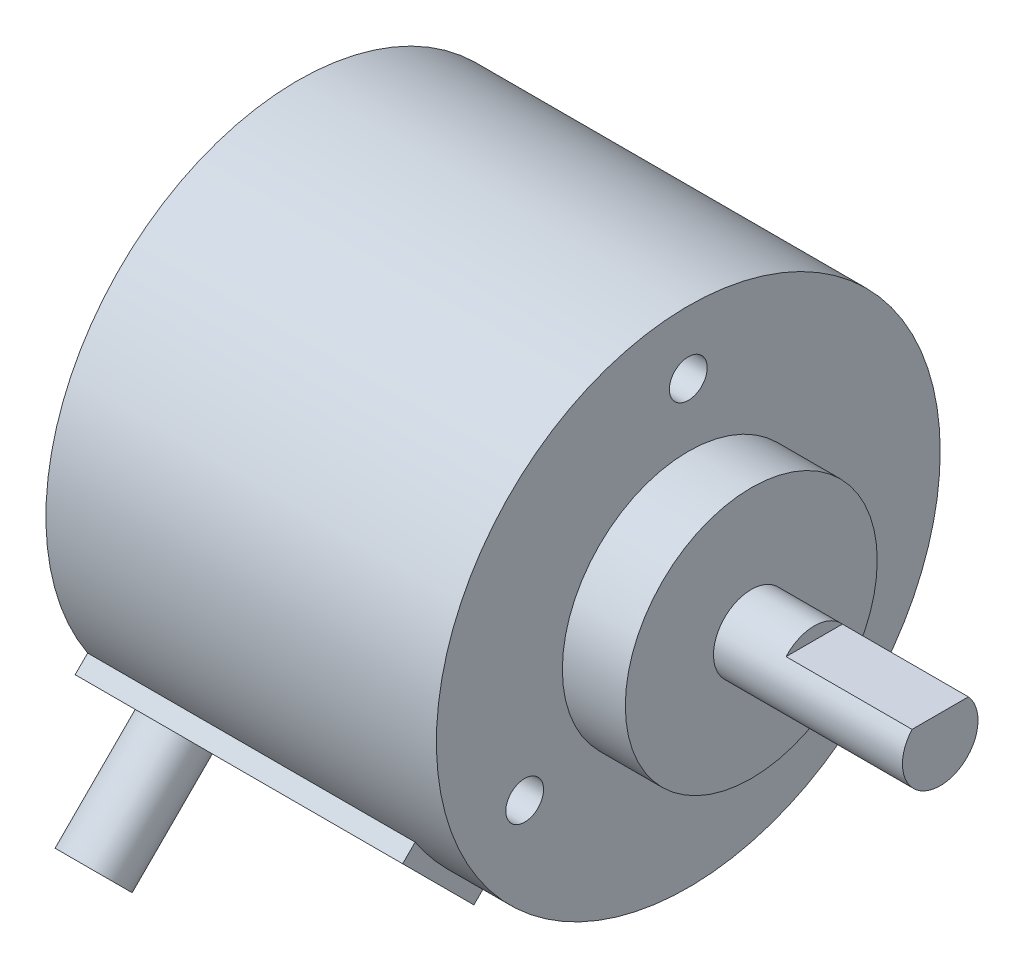
ISO-10303-21;
HEADER;
FILE_DESCRIPTION(('STEP AP214'),'2;1');
FILE_NAME('part.step','',(''),(''),'','','');
FILE_SCHEMA(('AUTOMOTIVE_DESIGN { 1 0 10303 214 1 1 1 1 }'));
ENDSEC;
DATA;
#1=APPLICATION_CONTEXT('core data for automotive mechanical design processes');
#2=APPLICATION_PROTOCOL_DEFINITION('international standard','automotive_design',2000,#1);
#3=PRODUCT_CONTEXT('',#1,'mechanical');
#4=PRODUCT('Part','Part','',(#3));
#5=PRODUCT_RELATED_PRODUCT_CATEGORY('part','',(#4));
#6=PRODUCT_DEFINITION_FORMATION('','',#4);
#7=PRODUCT_DEFINITION_CONTEXT('part definition',#1,'design');
#8=PRODUCT_DEFINITION('design','',#6,#7);
#9=PRODUCT_DEFINITION_SHAPE('','',#8);
#10=(LENGTH_UNIT() NAMED_UNIT(*) SI_UNIT(.MILLI.,.METRE.));
#11=(NAMED_UNIT(*) PLANE_ANGLE_UNIT() SI_UNIT($,.RADIAN.));
#12=(NAMED_UNIT(*) SI_UNIT($,.STERADIAN.) SOLID_ANGLE_UNIT());
#13=UNCERTAINTY_MEASURE_WITH_UNIT(LENGTH_MEASURE(1.E-05),#10,'distance_accuracy_value','');
#14=(GEOMETRIC_REPRESENTATION_CONTEXT(3) GLOBAL_UNCERTAINTY_ASSIGNED_CONTEXT((#13)) GLOBAL_UNIT_ASSIGNED_CONTEXT((#10,
#11,#12)) REPRESENTATION_CONTEXT('',''));
#15=CARTESIAN_POINT('',(0.,0.,0.));
#16=DIRECTION('',(0.,0.,1.));
#17=DIRECTION('',(1.,0.,0.));
#18=AXIS2_PLACEMENT_3D('',#15,#16,#17);
#19=CARTESIAN_POINT('',(5.,0.,0.));
#20=DIRECTION('',(-1.,0.,0.));
#21=DIRECTION('',(0.,0.,1.));
#22=AXIS2_PLACEMENT_3D('',#19,#20,#21);
#23=CYLINDRICAL_SURFACE('',#22,20.);
#24=CARTESIAN_POINT('',(5.,0.,0.));
#25=DIRECTION('',(1.,0.,0.));
#26=DIRECTION('',(0.,0.,-1.));
#27=AXIS2_PLACEMENT_3D('',#24,#25,#26);
#28=CIRCLE('',#27,20.);
#29=CARTESIAN_POINT('',(5.,0.,-20.));
#30=VERTEX_POINT('',#29);
#31=EDGE_CURVE('E11',#30,#30,#28,.T.);
#32=ORIENTED_EDGE('',*,*,#31,.F.);
#33=EDGE_LOOP('',(#32));
#34=FACE_BOUND('',#33,.T.);
#35=DIRECTION('',(-1.,0.,0.));
#36=VECTOR('',#35,1.);
#37=CARTESIAN_POINT('',(5.,-11.0279793358049,16.6848335852971));
#38=LINE('',#37,#36);
#39=CARTESIAN_POINT('',(0.,-11.0279793358049,16.6848335852971));
#40=VERTEX_POINT('',#39);
#41=CARTESIAN_POINT('',(-26.,-11.0279793358049,16.6848335852972));
#42=VERTEX_POINT('',#41);
#43=EDGE_CURVE('E51',#40,#42,#38,.T.);
#44=ORIENTED_EDGE('',*,*,#43,.F.);
#45=CARTESIAN_POINT('',(0.,0.,0.));
#46=DIRECTION('',(1.,0.,0.));
#47=DIRECTION('',(0.,0.,-1.));
#48=AXIS2_PLACEMENT_3D('',#45,#46,#47);
#49=CIRCLE('',#48,20.);
#50=CARTESIAN_POINT('',(0.,-16.6848335852973,11.0279793358047));
#51=VERTEX_POINT('',#50);
#52=EDGE_CURVE('E98',#51,#40,#49,.F.);
#53=ORIENTED_EDGE('',*,*,#52,.F.);
#54=DIRECTION('',(-1.,0.,0.));
#55=VECTOR('',#54,1.);
#56=CARTESIAN_POINT('',(5.,-16.6848335852973,11.0279793358047));
#57=LINE('',#56,#55);
#58=CARTESIAN_POINT('',(-26.,-16.6848335852973,11.0279793358047));
#59=VERTEX_POINT('',#58);
#60=EDGE_CURVE('E106',#59,#51,#57,.F.);
#61=ORIENTED_EDGE('',*,*,#60,.F.);
#62=CARTESIAN_POINT('',(-26.,0.,0.));
#63=DIRECTION('',(-1.,0.,0.));
#64=DIRECTION('',(0.,0.,1.));
#65=AXIS2_PLACEMENT_3D('',#62,#63,#64);
#66=CIRCLE('',#65,20.);
#67=EDGE_CURVE('E110',#42,#59,#66,.T.);
#68=ORIENTED_EDGE('',*,*,#67,.F.);
#69=EDGE_LOOP('',(#44,#53,#61,#68));
#70=FACE_BOUND('',#69,.T.);
#71=ADVANCED_FACE('F35',(#34,#70),#23,.T.);
#72=CARTESIAN_POINT('',(10.,0.,0.));
#73=DIRECTION('',(1.,0.,0.));
#74=DIRECTION('',(0.,0.,-1.));
#75=AXIS2_PLACEMENT_3D('',#72,#73,#74);
#76=PLANE('',#75);
#77=CARTESIAN_POINT('',(10.,0.,0.));
#78=DIRECTION('',(1.,0.,0.));
#79=DIRECTION('',(0.,0.,-1.));
#80=AXIS2_PLACEMENT_3D('',#77,#78,#79);
#81=CIRCLE('',#80,10.);
#82=CARTESIAN_POINT('',(10.,0.,-10.));
#83=VERTEX_POINT('',#82);
#84=EDGE_CURVE('E43',#83,#83,#81,.T.);
#85=ORIENTED_EDGE('',*,*,#84,.T.);
#86=EDGE_LOOP('',(#85));
#87=FACE_BOUND('',#86,.T.);
#88=CARTESIAN_POINT('',(10.,0.,0.));
#89=DIRECTION('',(1.,0.,0.));
#90=DIRECTION('',(0.,0.,-1.));
#91=AXIS2_PLACEMENT_3D('',#88,#89,#90);
#92=CIRCLE('',#91,3.);
#93=CARTESIAN_POINT('',(10.,0.,-3.));
#94=VERTEX_POINT('',#93);
#95=EDGE_CURVE('E136',#94,#94,#92,.T.);
#96=ORIENTED_EDGE('',*,*,#95,.F.);
#97=EDGE_LOOP('',(#96));
#98=FACE_BOUND('',#97,.T.);
#99=ADVANCED_FACE('F194',(#87,#98),#76,.T.);
#100=CARTESIAN_POINT('',(5.,0.,0.));
#101=DIRECTION('',(1.,0.,0.));
#102=DIRECTION('',(0.,0.,-1.));
#103=AXIS2_PLACEMENT_3D('',#100,#101,#102);
#104=PLANE('',#103);
#105=CARTESIAN_POINT('',(5.,-7.50000000000001,12.9903810567666));
#106=DIRECTION('',(1.,0.,0.));
#107=DIRECTION('',(0.,0.,-1.));
#108=AXIS2_PLACEMENT_3D('',#105,#106,#107);
#109=CIRCLE('',#108,1.5);
#110=CARTESIAN_POINT('',(5.,-7.50000000000001,11.4903810567666));
#111=VERTEX_POINT('',#110);
#112=EDGE_CURVE('E156',#111,#111,#109,.T.);
#113=ORIENTED_EDGE('',*,*,#112,.F.);
#114=EDGE_LOOP('',(#113));
#115=FACE_BOUND('',#114,.T.);
#116=CARTESIAN_POINT('',(5.,-7.5,-12.9903810567666));
#117=DIRECTION('',(1.,0.,0.));
#118=DIRECTION('',(0.,0.,-1.));
#119=AXIS2_PLACEMENT_3D('',#116,#117,#118);
#120=CIRCLE('',#119,1.5);
#121=CARTESIAN_POINT('',(5.,-7.5,-14.4903810567666));
#122=VERTEX_POINT('',#121);
#123=EDGE_CURVE('E173',#122,#122,#120,.T.);
#124=ORIENTED_EDGE('',*,*,#123,.F.);
#125=EDGE_LOOP('',(#124));
#126=FACE_BOUND('',#125,.T.);
#127=CARTESIAN_POINT('',(5.,15.,0.));
#128=DIRECTION('',(1.,0.,0.));
#129=DIRECTION('',(0.,0.,-1.));
#130=AXIS2_PLACEMENT_3D('',#127,#128,#129);
#131=CIRCLE('',#130,1.50000000000105);
#132=CARTESIAN_POINT('',(5.,15.,-1.50000000000105));
#133=VERTEX_POINT('',#132);
#134=EDGE_CURVE('E167',#133,#133,#131,.T.);
#135=ORIENTED_EDGE('',*,*,#134,.F.);
#136=EDGE_LOOP('',(#135));
#137=FACE_BOUND('',#136,.T.);
#138=ORIENTED_EDGE('',*,*,#31,.T.);
#139=EDGE_LOOP('',(#138));
#140=FACE_BOUND('',#139,.T.);
#141=CARTESIAN_POINT('',(5.,0.,0.));
#142=DIRECTION('',(1.,0.,0.));
#143=DIRECTION('',(0.,0.,-1.));
#144=AXIS2_PLACEMENT_3D('',#141,#142,#143);
#145=CIRCLE('',#144,10.);
#146=CARTESIAN_POINT('',(5.,0.,-10.));
#147=VERTEX_POINT('',#146);
#148=EDGE_CURVE('E161',#147,#147,#145,.T.);
#149=ORIENTED_EDGE('',*,*,#148,.F.);
#150=EDGE_LOOP('',(#149));
#151=FACE_BOUND('',#150,.T.);
#152=ADVANCED_FACE('F190',(#115,#126,#137,#140,#151),#104,.T.);
#153=CARTESIAN_POINT('',(10.,0.,0.));
#154=DIRECTION('',(-1.,0.,0.));
#155=DIRECTION('',(0.,0.,1.));
#156=AXIS2_PLACEMENT_3D('',#153,#154,#155);
#157=CYLINDRICAL_SURFACE('',#156,10.);
#158=ORIENTED_EDGE('',*,*,#84,.F.);
#159=EDGE_LOOP('',(#158));
#160=FACE_BOUND('',#159,.T.);
#161=ORIENTED_EDGE('',*,*,#148,.T.);
#162=EDGE_LOOP('',(#161));
#163=FACE_BOUND('',#162,.T.);
#164=ADVANCED_FACE('F193',(#160,#163),#157,.T.);
#165=CARTESIAN_POINT('',(0.,15.,0.));
#166=DIRECTION('',(1.,0.,0.));
#167=DIRECTION('',(0.,0.,-1.));
#168=AXIS2_PLACEMENT_3D('',#165,#166,#167);
#169=CYLINDRICAL_SURFACE('',#168,1.50000000000105);
#170=CARTESIAN_POINT('',(0.,15.,0.));
#171=DIRECTION('',(1.,0.,0.));
#172=DIRECTION('',(0.,0.,-1.));
#173=AXIS2_PLACEMENT_3D('',#170,#171,#172);
#174=CIRCLE('',#173,1.50000000000105);
#175=CARTESIAN_POINT('',(0.,15.,-1.50000000000105));
#176=VERTEX_POINT('',#175);
#177=EDGE_CURVE('E164',#176,#176,#174,.T.);
#178=ORIENTED_EDGE('',*,*,#177,.F.);
#179=EDGE_LOOP('',(#178));
#180=FACE_BOUND('',#179,.T.);
#181=ORIENTED_EDGE('',*,*,#134,.T.);
#182=EDGE_LOOP('',(#181));
#183=FACE_BOUND('',#182,.T.);
#184=ADVANCED_FACE('F204',(#180,#183),#169,.F.);
#185=CARTESIAN_POINT('',(0.,-7.5,-12.9903810567666));
#186=DIRECTION('',(1.,0.,0.));
#187=DIRECTION('',(0.,0.,-1.));
#188=AXIS2_PLACEMENT_3D('',#185,#186,#187);
#189=CYLINDRICAL_SURFACE('',#188,1.5);
#190=CARTESIAN_POINT('',(0.,-7.5,-12.9903810567666));
#191=DIRECTION('',(1.,0.,0.));
#192=DIRECTION('',(0.,0.,-1.));
#193=AXIS2_PLACEMENT_3D('',#190,#191,#192);
#194=CIRCLE('',#193,1.5);
#195=CARTESIAN_POINT('',(0.,-7.5,-14.4903810567666));
#196=VERTEX_POINT('',#195);
#197=EDGE_CURVE('E170',#196,#196,#194,.T.);
#198=ORIENTED_EDGE('',*,*,#197,.F.);
#199=EDGE_LOOP('',(#198));
#200=FACE_BOUND('',#199,.T.);
#201=ORIENTED_EDGE('',*,*,#123,.T.);
#202=EDGE_LOOP('',(#201));
#203=FACE_BOUND('',#202,.T.);
#204=ADVANCED_FACE('F186',(#200,#203),#189,.F.);
#205=CARTESIAN_POINT('',(0.,-7.50000000000001,12.9903810567666));
#206=DIRECTION('',(1.,0.,0.));
#207=DIRECTION('',(0.,0.,-1.));
#208=AXIS2_PLACEMENT_3D('',#205,#206,#207);
#209=CYLINDRICAL_SURFACE('',#208,1.5);
#210=CARTESIAN_POINT('',(0.,-7.50000000000001,12.9903810567666));
#211=DIRECTION('',(1.,0.,0.));
#212=DIRECTION('',(0.,0.,-1.));
#213=AXIS2_PLACEMENT_3D('',#210,#211,#212);
#214=CIRCLE('',#213,1.5);
#215=CARTESIAN_POINT('',(0.,-7.50000000000001,11.4903810567666));
#216=VERTEX_POINT('',#215);
#217=EDGE_CURVE('E158',#216,#216,#214,.T.);
#218=ORIENTED_EDGE('',*,*,#217,.F.);
#219=EDGE_LOOP('',(#218));
#220=FACE_BOUND('',#219,.T.);
#221=ORIENTED_EDGE('',*,*,#112,.T.);
#222=EDGE_LOOP('',(#221));
#223=FACE_BOUND('',#222,.T.);
#224=ADVANCED_FACE('F182',(#220,#223),#209,.F.);
#225=CARTESIAN_POINT('',(15.,0.,0.));
#226=DIRECTION('',(-1.,0.,0.));
#227=DIRECTION('',(0.,0.,1.));
#228=AXIS2_PLACEMENT_3D('',#225,#226,#227);
#229=CYLINDRICAL_SURFACE('',#228,3.);
#230=CARTESIAN_POINT('',(15.,0.,0.));
#231=DIRECTION('',(1.,0.,0.));
#232=DIRECTION('',(0.,0.,-1.));
#233=AXIS2_PLACEMENT_3D('',#230,#231,#232);
#234=CIRCLE('',#233,3.);
#235=CARTESIAN_POINT('',(15.,2.,-2.23606797749979));
#236=VERTEX_POINT('',#235);
#237=CARTESIAN_POINT('',(15.,2.,2.23606797749979));
#238=VERTEX_POINT('',#237);
#239=EDGE_CURVE('E153',#236,#238,#234,.T.);
#240=ORIENTED_EDGE('',*,*,#239,.F.);
#241=DIRECTION('',(-1.,0.,0.));
#242=VECTOR('',#241,1.);
#243=CARTESIAN_POINT('',(25.,2.,-2.23606797749979));
#244=LINE('',#243,#242);
#245=CARTESIAN_POINT('',(25.,2.,-2.23606797749979));
#246=VERTEX_POINT('',#245);
#247=EDGE_CURVE('E145',#246,#236,#244,.T.);
#248=ORIENTED_EDGE('',*,*,#247,.F.);
#249=CARTESIAN_POINT('',(25.,0.,0.));
#250=DIRECTION('',(1.,0.,0.));
#251=DIRECTION('',(0.,0.,-1.));
#252=AXIS2_PLACEMENT_3D('',#249,#250,#251);
#253=CIRCLE('',#252,3.);
#254=CARTESIAN_POINT('',(25.,2.,2.23606797749979));
#255=VERTEX_POINT('',#254);
#256=EDGE_CURVE('E128',#255,#246,#253,.T.);
#257=ORIENTED_EDGE('',*,*,#256,.F.);
#258=DIRECTION('',(-1.,0.,0.));
#259=VECTOR('',#258,1.);
#260=CARTESIAN_POINT('',(25.,2.,2.23606797749979));
#261=LINE('',#260,#259);
#262=EDGE_CURVE('E133',#255,#238,#261,.T.);
#263=ORIENTED_EDGE('',*,*,#262,.T.);
#264=EDGE_LOOP('',(#240,#248,#257,#263));
#265=FACE_BOUND('',#264,.T.);
#266=ORIENTED_EDGE('',*,*,#95,.T.);
#267=EDGE_LOOP('',(#266));
#268=FACE_BOUND('',#267,.T.);
#269=ADVANCED_FACE('F185',(#265,#268),#229,.T.);
#270=CARTESIAN_POINT('',(15.,0.,0.));
#271=DIRECTION('',(1.,0.,0.));
#272=DIRECTION('',(0.,0.,-1.));
#273=AXIS2_PLACEMENT_3D('',#270,#271,#272);
#274=PLANE('',#273);
#275=DIRECTION('',(0.,0.,1.));
#276=VECTOR('',#275,1.);
#277=CARTESIAN_POINT('',(15.,2.,2.23606797749979));
#278=LINE('',#277,#276);
#279=EDGE_CURVE('E58',#236,#238,#278,.T.);
#280=ORIENTED_EDGE('',*,*,#279,.F.);
#281=ORIENTED_EDGE('',*,*,#239,.T.);
#282=EDGE_LOOP('',(#280,#281));
#283=FACE_BOUND('',#282,.T.);
#284=ADVANCED_FACE('F231',(#283),#274,.T.);
#285=CARTESIAN_POINT('',(25.,2.,2.23606797749979));
#286=DIRECTION('',(0.,-1.,0.));
#287=DIRECTION('',(0.,0.,-1.));
#288=AXIS2_PLACEMENT_3D('',#285,#286,#287);
#289=PLANE('',#288);
#290=ORIENTED_EDGE('',*,*,#279,.T.);
#291=ORIENTED_EDGE('',*,*,#262,.F.);
#292=DIRECTION('',(0.,0.,1.));
#293=VECTOR('',#292,1.);
#294=CARTESIAN_POINT('',(25.,2.,2.23606797749979));
#295=LINE('',#294,#293);
#296=EDGE_CURVE('E131',#246,#255,#295,.T.);
#297=ORIENTED_EDGE('',*,*,#296,.F.);
#298=ORIENTED_EDGE('',*,*,#247,.T.);
#299=EDGE_LOOP('',(#290,#291,#297,#298));
#300=FACE_BOUND('',#299,.T.);
#301=ADVANCED_FACE('F235',(#300),#289,.F.);
#302=CARTESIAN_POINT('',(25.,0.,0.));
#303=DIRECTION('',(1.,0.,0.));
#304=DIRECTION('',(0.,0.,-1.));
#305=AXIS2_PLACEMENT_3D('',#302,#303,#304);
#306=PLANE('',#305);
#307=ORIENTED_EDGE('',*,*,#256,.T.);
#308=ORIENTED_EDGE('',*,*,#296,.T.);
#309=EDGE_LOOP('',(#307,#308));
#310=FACE_BOUND('',#309,.T.);
#311=ADVANCED_FACE('F238',(#310),#306,.T.);
#312=CARTESIAN_POINT('',(0.,0.,0.));
#313=DIRECTION('',(-1.,0.,0.));
#314=DIRECTION('',(0.,0.,1.));
#315=AXIS2_PLACEMENT_3D('',#312,#313,#314);
#316=PLANE('',#315);
#317=ORIENTED_EDGE('',*,*,#217,.T.);
#318=EDGE_LOOP('',(#317));
#319=FACE_BOUND('',#318,.T.);
#320=ADVANCED_FACE('F180',(#319),#316,.F.);
#321=ORIENTED_EDGE('',*,*,#197,.T.);
#322=EDGE_LOOP('',(#321));
#323=FACE_BOUND('',#322,.T.);
#324=ADVANCED_FACE('F246',(#323),#316,.F.);
#325=ORIENTED_EDGE('',*,*,#177,.T.);
#326=EDGE_LOOP('',(#325));
#327=FACE_BOUND('',#326,.T.);
#328=ADVANCED_FACE('F242',(#327),#316,.F.);
#329=CARTESIAN_POINT('',(-26.,0.,0.));
#330=DIRECTION('',(-1.,0.,0.));
#331=DIRECTION('',(0.,0.,1.));
#332=AXIS2_PLACEMENT_3D('',#329,#330,#331);
#333=PLANE('',#332);
#334=ORIENTED_EDGE('',*,*,#67,.T.);
#335=DIRECTION('',(0.,0.707106781186551,-0.707106781186544));
#336=VECTOR('',#335,1.);
#337=CARTESIAN_POINT('',(-26.,-17.6776695296638,12.0208152801712));
#338=LINE('',#337,#336);
#339=CARTESIAN_POINT('',(-26.,-17.6776695296638,12.0208152801712));
#340=VERTEX_POINT('',#339);
#341=EDGE_CURVE('E121',#340,#59,#338,.T.);
#342=ORIENTED_EDGE('',*,*,#341,.F.);
#343=DIRECTION('',(0.,-0.707106781186544,-0.707106781186551));
#344=VECTOR('',#343,1.);
#345=CARTESIAN_POINT('',(-26.,-12.0208152801714,17.6776695296636));
#346=LINE('',#345,#344);
#347=CARTESIAN_POINT('',(-26.,-12.0208152801714,17.6776695296636));
#348=VERTEX_POINT('',#347);
#349=EDGE_CURVE('E116',#348,#340,#346,.T.);
#350=ORIENTED_EDGE('',*,*,#349,.F.);
#351=DIRECTION('',(0.,0.707106781186551,-0.707106781186544));
#352=VECTOR('',#351,1.);
#353=CARTESIAN_POINT('',(-26.,-12.0208152801714,17.6776695296636));
#354=LINE('',#353,#352);
#355=EDGE_CURVE('E95',#348,#42,#354,.T.);
#356=ORIENTED_EDGE('',*,*,#355,.T.);
#357=EDGE_LOOP('',(#334,#342,#350,#356));
#358=FACE_BOUND('',#357,.T.);
#359=ADVANCED_FACE('F245',(#358),#333,.T.);
#360=CARTESIAN_POINT('',(0.,-14.8492424049176,14.8492424049174));
#361=DIRECTION('',(0.,-0.707106781186551,0.707106781186544));
#362=DIRECTION('',(0.,-0.707106781186544,-0.707106781186551));
#363=AXIS2_PLACEMENT_3D('',#360,#361,#362);
#364=PLANE('',#363);
#365=DIRECTION('',(0.,0.707106781186544,0.707106781186551));
#366=VECTOR('',#365,1.);
#367=CARTESIAN_POINT('',(0.,-12.0208152801714,17.6776695296636));
#368=LINE('',#367,#366);
#369=CARTESIAN_POINT('',(0.,-17.6776695296638,12.0208152801712));
#370=VERTEX_POINT('',#369);
#371=CARTESIAN_POINT('',(0.,-12.0208152801714,17.6776695296636));
#372=VERTEX_POINT('',#371);
#373=EDGE_CURVE('E105',#370,#372,#368,.T.);
#374=ORIENTED_EDGE('',*,*,#373,.T.);
#375=DIRECTION('',(-1.,0.,0.));
#376=VECTOR('',#375,1.);
#377=CARTESIAN_POINT('',(-26.,-12.0208152801714,17.6776695296636));
#378=LINE('',#377,#376);
#379=EDGE_CURVE('E91',#372,#348,#378,.T.);
#380=ORIENTED_EDGE('',*,*,#379,.T.);
#381=ORIENTED_EDGE('',*,*,#349,.T.);
#382=DIRECTION('',(1.,0.,0.));
#383=VECTOR('',#382,1.);
#384=CARTESIAN_POINT('',(-26.,-17.6776695296638,12.0208152801712));
#385=LINE('',#384,#383);
#386=EDGE_CURVE('E118',#340,#370,#385,.T.);
#387=ORIENTED_EDGE('',*,*,#386,.T.);
#388=EDGE_LOOP('',(#374,#380,#381,#387));
#389=FACE_BOUND('',#388,.T.);
#390=CARTESIAN_POINT('',(-21.,-14.8492424049176,14.8492424049174));
#391=DIRECTION('',(0.,-0.707106781186551,0.707106781186544));
#392=DIRECTION('',(0.,-0.707106781186544,-0.707106781186551));
#393=AXIS2_PLACEMENT_3D('',#390,#391,#392);
#394=CIRCLE('',#393,2.5);
#395=CARTESIAN_POINT('',(-21.,-16.6170093578839,13.081475451951));
#396=VERTEX_POINT('',#395);
#397=EDGE_CURVE('E38',#396,#396,#394,.T.);
#398=ORIENTED_EDGE('',*,*,#397,.F.);
#399=EDGE_LOOP('',(#398));
#400=FACE_BOUND('',#399,.T.);
#401=ADVANCED_FACE('F250',(#389,#400),#364,.T.);
#402=CARTESIAN_POINT('',(0.,-12.0208152801714,17.6776695296636));
#403=DIRECTION('',(-1.,0.,0.));
#404=DIRECTION('',(0.,0.,1.));
#405=AXIS2_PLACEMENT_3D('',#402,#403,#404);
#406=PLANE('',#405);
#407=DIRECTION('',(0.,0.707106781186551,-0.707106781186544));
#408=VECTOR('',#407,1.);
#409=CARTESIAN_POINT('',(0.,-17.6776695296638,12.0208152801712));
#410=LINE('',#409,#408);
#411=EDGE_CURVE('E101',#370,#51,#410,.T.);
#412=ORIENTED_EDGE('',*,*,#411,.T.);
#413=ORIENTED_EDGE('',*,*,#52,.T.);
#414=DIRECTION('',(0.,0.707106781186551,-0.707106781186544));
#415=VECTOR('',#414,1.);
#416=CARTESIAN_POINT('',(0.,-12.0208152801714,17.6776695296636));
#417=LINE('',#416,#415);
#418=EDGE_CURVE('E88',#372,#40,#417,.T.);
#419=ORIENTED_EDGE('',*,*,#418,.F.);
#420=ORIENTED_EDGE('',*,*,#373,.F.);
#421=EDGE_LOOP('',(#412,#413,#419,#420));
#422=FACE_BOUND('',#421,.T.);
#423=ADVANCED_FACE('F99',(#422),#406,.F.);
#424=CARTESIAN_POINT('',(-26.,-12.0208152801714,17.6776695296636));
#425=DIRECTION('',(0.,-0.707106781186544,-0.707106781186551));
#426=DIRECTION('',(0.,0.707106781186551,-0.707106781186544));
#427=AXIS2_PLACEMENT_3D('',#424,#425,#426);
#428=PLANE('',#427);
#429=ORIENTED_EDGE('',*,*,#418,.T.);
#430=ORIENTED_EDGE('',*,*,#43,.T.);
#431=ORIENTED_EDGE('',*,*,#355,.F.);
#432=ORIENTED_EDGE('',*,*,#379,.F.);
#433=EDGE_LOOP('',(#429,#430,#431,#432));
#434=FACE_BOUND('',#433,.T.);
#435=ADVANCED_FACE('F90',(#434),#428,.F.);
#436=CARTESIAN_POINT('',(-26.,-17.6776695296638,12.0208152801712));
#437=DIRECTION('',(0.,0.707106781186544,0.707106781186551));
#438=DIRECTION('',(0.,-0.707106781186551,0.707106781186544));
#439=AXIS2_PLACEMENT_3D('',#436,#437,#438);
#440=PLANE('',#439);
#441=ORIENTED_EDGE('',*,*,#341,.T.);
#442=ORIENTED_EDGE('',*,*,#60,.T.);
#443=ORIENTED_EDGE('',*,*,#411,.F.);
#444=ORIENTED_EDGE('',*,*,#386,.F.);
#445=EDGE_LOOP('',(#441,#442,#443,#444));
#446=FACE_BOUND('',#445,.T.);
#447=ADVANCED_FACE('F259',(#446),#440,.F.);
#448=CARTESIAN_POINT('',(-21.,-21.2132034355965,21.2132034355963));
#449=DIRECTION('',(0.,-0.707106781186551,0.707106781186544));
#450=DIRECTION('',(0.,-0.707106781186544,-0.707106781186551));
#451=AXIS2_PLACEMENT_3D('',#448,#449,#450);
#452=PLANE('',#451);
#453=CARTESIAN_POINT('',(-21.,-21.2132034355965,21.2132034355963));
#454=DIRECTION('',(0.,-0.707106781186551,0.707106781186544));
#455=DIRECTION('',(0.,-0.707106781186544,-0.707106781186551));
#456=AXIS2_PLACEMENT_3D('',#453,#454,#455);
#457=CIRCLE('',#456,2.5);
#458=CARTESIAN_POINT('',(-21.,-22.9809703885629,19.4454364826299));
#459=VERTEX_POINT('',#458);
#460=EDGE_CURVE('E124',#459,#459,#457,.T.);
#461=ORIENTED_EDGE('',*,*,#460,.T.);
#462=EDGE_LOOP('',(#461));
#463=FACE_BOUND('',#462,.T.);
#464=ADVANCED_FACE('F255',(#463),#452,.T.);
#465=CARTESIAN_POINT('',(-21.,-21.2132034355965,21.2132034355963));
#466=DIRECTION('',(0.,0.707106781186551,-0.707106781186544));
#467=DIRECTION('',(0.,0.707106781186544,0.707106781186551));
#468=AXIS2_PLACEMENT_3D('',#465,#466,#467);
#469=CYLINDRICAL_SURFACE('',#468,2.5);
#470=ORIENTED_EDGE('',*,*,#397,.T.);
#471=EDGE_LOOP('',(#470));
#472=FACE_BOUND('',#471,.T.);
#473=ORIENTED_EDGE('',*,*,#460,.F.);
#474=EDGE_LOOP('',(#473));
#475=FACE_BOUND('',#474,.T.);
#476=ADVANCED_FACE('F252',(#472,#475),#469,.T.);
#477=CLOSED_SHELL('',(#71,#99,#152,#164,#184,#204,#224,#269,#284,#301,#311,#320,#324,#328,#359,
#401,#423,#435,#447,#464,#476));
#478=MANIFOLD_SOLID_BREP('B2',#477);
#479=ADVANCED_BREP_SHAPE_REPRESENTATION('',(#18,#478),#14);
#480=SHAPE_DEFINITION_REPRESENTATION(#9,#479);
ENDSEC;
END-ISO-10303-21;
